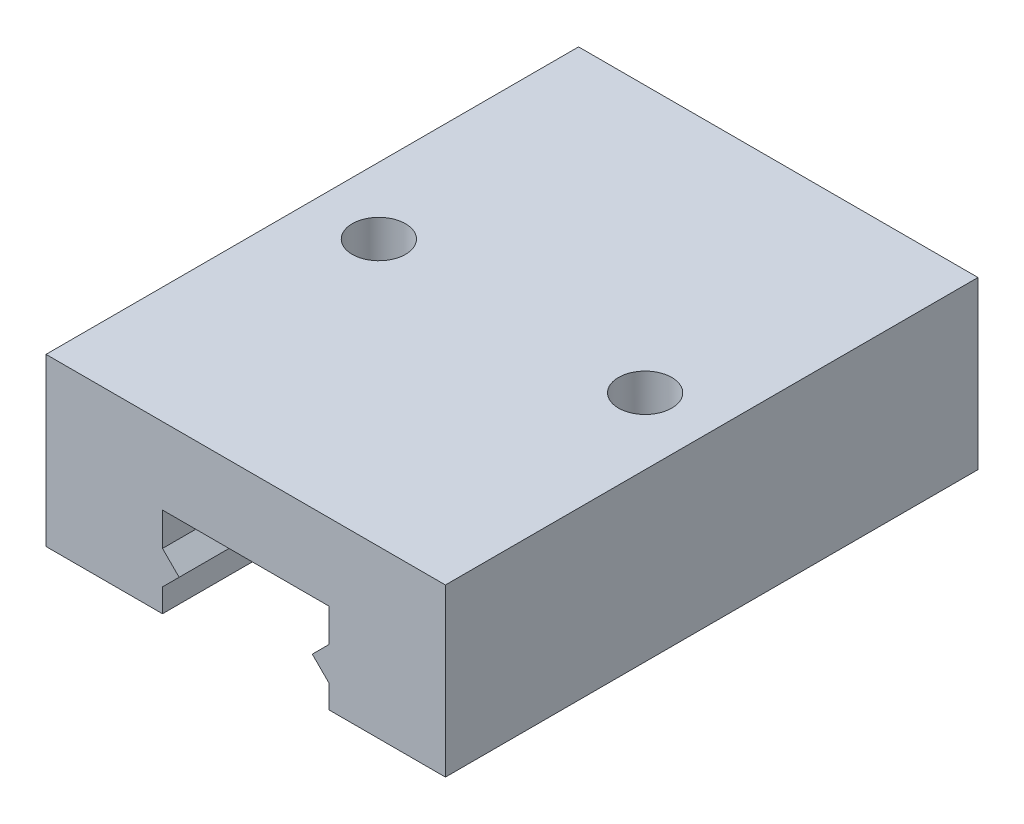
ISO-10303-21;
HEADER;
FILE_DESCRIPTION(('STEP AP214'),'2;1');
FILE_NAME('part.step','',(''),(''),'','','');
FILE_SCHEMA(('AUTOMOTIVE_DESIGN { 1 0 10303 214 1 1 1 1 }'));
ENDSEC;
DATA;
#1=APPLICATION_CONTEXT('core data for automotive mechanical design processes');
#2=APPLICATION_PROTOCOL_DEFINITION('international standard','automotive_design',2000,#1);
#3=PRODUCT_CONTEXT('',#1,'mechanical');
#4=PRODUCT('Part','Part','',(#3));
#5=PRODUCT_RELATED_PRODUCT_CATEGORY('part','',(#4));
#6=PRODUCT_DEFINITION_FORMATION('','',#4);
#7=PRODUCT_DEFINITION_CONTEXT('part definition',#1,'design');
#8=PRODUCT_DEFINITION('design','',#6,#7);
#9=PRODUCT_DEFINITION_SHAPE('','',#8);
#10=(LENGTH_UNIT() NAMED_UNIT(*) SI_UNIT(.MILLI.,.METRE.));
#11=(NAMED_UNIT(*) PLANE_ANGLE_UNIT() SI_UNIT($,.RADIAN.));
#12=(NAMED_UNIT(*) SI_UNIT($,.STERADIAN.) SOLID_ANGLE_UNIT());
#13=UNCERTAINTY_MEASURE_WITH_UNIT(LENGTH_MEASURE(1.E-05),#10,'distance_accuracy_value','');
#14=(GEOMETRIC_REPRESENTATION_CONTEXT(3) GLOBAL_UNCERTAINTY_ASSIGNED_CONTEXT((#13)) GLOBAL_UNIT_ASSIGNED_CONTEXT((#10,
#11,#12)) REPRESENTATION_CONTEXT('',''));
#15=CARTESIAN_POINT('',(0.,0.,0.));
#16=DIRECTION('',(0.,0.,1.));
#17=DIRECTION('',(1.,0.,0.));
#18=AXIS2_PLACEMENT_3D('',#15,#16,#17);
#19=CARTESIAN_POINT('',(-6.,0.,16.));
#20=DIRECTION('',(1.,0.,0.));
#21=DIRECTION('',(0.,1.,0.));
#22=AXIS2_PLACEMENT_3D('',#19,#20,#21);
#23=PLANE('',#22);
#24=DIRECTION('',(0.,-1.,0.));
#25=VECTOR('',#24,1.);
#26=CARTESIAN_POINT('',(-6.,0.,0.));
#27=LINE('',#26,#25);
#28=CARTESIAN_POINT('',(-6.,0.,0.));
#29=VERTEX_POINT('',#28);
#30=CARTESIAN_POINT('',(-6.,-5.,0.));
#31=VERTEX_POINT('',#30);
#32=EDGE_CURVE('E173',#29,#31,#27,.T.);
#33=ORIENTED_EDGE('',*,*,#32,.T.);
#34=DIRECTION('',(0.,0.,-1.));
#35=VECTOR('',#34,1.);
#36=CARTESIAN_POINT('',(-6.,-5.,16.));
#37=LINE('',#36,#35);
#38=CARTESIAN_POINT('',(-6.,-5.,16.));
#39=VERTEX_POINT('',#38);
#40=EDGE_CURVE('E11',#39,#31,#37,.T.);
#41=ORIENTED_EDGE('',*,*,#40,.F.);
#42=DIRECTION('',(0.,-1.,0.));
#43=VECTOR('',#42,1.);
#44=CARTESIAN_POINT('',(-6.,0.,16.));
#45=LINE('',#44,#43);
#46=CARTESIAN_POINT('',(-6.,0.,16.));
#47=VERTEX_POINT('',#46);
#48=EDGE_CURVE('E200',#47,#39,#45,.T.);
#49=ORIENTED_EDGE('',*,*,#48,.F.);
#50=DIRECTION('',(0.,0.,-1.));
#51=VECTOR('',#50,1.);
#52=CARTESIAN_POINT('',(-6.,0.,16.));
#53=LINE('',#52,#51);
#54=EDGE_CURVE('E169',#47,#29,#53,.T.);
#55=ORIENTED_EDGE('',*,*,#54,.T.);
#56=EDGE_LOOP('',(#33,#41,#49,#55));
#57=FACE_BOUND('',#56,.T.);
#58=ADVANCED_FACE('F41',(#57),#23,.F.);
#59=CARTESIAN_POINT('',(-6.,-5.,16.));
#60=DIRECTION('',(0.,1.,0.));
#61=DIRECTION('',(0.,0.,1.));
#62=AXIS2_PLACEMENT_3D('',#59,#60,#61);
#63=PLANE('',#62);
#64=CARTESIAN_POINT('',(-4.,-5.,8.));
#65=DIRECTION('',(0.,1.,0.));
#66=DIRECTION('',(0.,0.,1.));
#67=AXIS2_PLACEMENT_3D('',#64,#65,#66);
#68=CIRCLE('',#67,0.8);
#69=CARTESIAN_POINT('',(-4.,-5.,8.8));
#70=VERTEX_POINT('',#69);
#71=EDGE_CURVE('E177',#70,#70,#68,.T.);
#72=ORIENTED_EDGE('',*,*,#71,.T.);
#73=EDGE_LOOP('',(#72));
#74=FACE_BOUND('',#73,.T.);
#75=DIRECTION('',(1.,0.,0.));
#76=VECTOR('',#75,1.);
#77=CARTESIAN_POINT('',(-6.,-5.,0.));
#78=LINE('',#77,#76);
#79=CARTESIAN_POINT('',(-2.5,-5.,0.));
#80=VERTEX_POINT('',#79);
#81=EDGE_CURVE('E176',#31,#80,#78,.T.);
#82=ORIENTED_EDGE('',*,*,#81,.T.);
#83=DIRECTION('',(0.,0.,-1.));
#84=VECTOR('',#83,1.);
#85=CARTESIAN_POINT('',(-2.5,-5.,16.));
#86=LINE('',#85,#84);
#87=CARTESIAN_POINT('',(-2.5,-5.,16.));
#88=VERTEX_POINT('',#87);
#89=EDGE_CURVE('E49',#88,#80,#86,.T.);
#90=ORIENTED_EDGE('',*,*,#89,.F.);
#91=DIRECTION('',(1.,0.,0.));
#92=VECTOR('',#91,1.);
#93=CARTESIAN_POINT('',(-6.,-5.,16.));
#94=LINE('',#93,#92);
#95=EDGE_CURVE('E118',#39,#88,#94,.T.);
#96=ORIENTED_EDGE('',*,*,#95,.F.);
#97=ORIENTED_EDGE('',*,*,#40,.T.);
#98=EDGE_LOOP('',(#82,#90,#96,#97));
#99=FACE_BOUND('',#98,.T.);
#100=ADVANCED_FACE('F291',(#74,#99),#63,.F.);
#101=CARTESIAN_POINT('',(-2.5,-5.,16.));
#102=DIRECTION('',(-1.,0.,0.));
#103=DIRECTION('',(0.,0.,1.));
#104=AXIS2_PLACEMENT_3D('',#101,#102,#103);
#105=PLANE('',#104);
#106=DIRECTION('',(0.,1.,0.));
#107=VECTOR('',#106,1.);
#108=CARTESIAN_POINT('',(-2.5,-5.,0.));
#109=LINE('',#108,#107);
#110=CARTESIAN_POINT('',(-2.5,-4.3,0.));
#111=VERTEX_POINT('',#110);
#112=EDGE_CURVE('E179',#80,#111,#109,.T.);
#113=ORIENTED_EDGE('',*,*,#112,.T.);
#114=DIRECTION('',(0.,0.,-1.));
#115=VECTOR('',#114,1.);
#116=CARTESIAN_POINT('',(-2.5,-4.3,16.));
#117=LINE('',#116,#115);
#118=CARTESIAN_POINT('',(-2.5,-4.3,16.));
#119=VERTEX_POINT('',#118);
#120=EDGE_CURVE('E225',#119,#111,#117,.T.);
#121=ORIENTED_EDGE('',*,*,#120,.F.);
#122=DIRECTION('',(0.,1.,0.));
#123=VECTOR('',#122,1.);
#124=CARTESIAN_POINT('',(-2.5,-5.,16.));
#125=LINE('',#124,#123);
#126=EDGE_CURVE('E233',#88,#119,#125,.T.);
#127=ORIENTED_EDGE('',*,*,#126,.F.);
#128=ORIENTED_EDGE('',*,*,#89,.T.);
#129=EDGE_LOOP('',(#113,#121,#127,#128));
#130=FACE_BOUND('',#129,.T.);
#131=ADVANCED_FACE('F231',(#130),#105,.F.);
#132=CARTESIAN_POINT('',(-2.5,-4.3,16.));
#133=DIRECTION('',(-0.707106781186549,0.707106781186546,0.));
#134=DIRECTION('',(-0.707106781186546,-0.707106781186549,0.));
#135=AXIS2_PLACEMENT_3D('',#132,#133,#134);
#136=PLANE('',#135);
#137=DIRECTION('',(0.707106781186546,0.707106781186549,0.));
#138=VECTOR('',#137,1.);
#139=CARTESIAN_POINT('',(-2.5,-4.3,0.));
#140=LINE('',#139,#138);
#141=CARTESIAN_POINT('',(-2.,-3.8,0.));
#142=VERTEX_POINT('',#141);
#143=EDGE_CURVE('E181',#111,#142,#140,.T.);
#144=ORIENTED_EDGE('',*,*,#143,.T.);
#145=DIRECTION('',(0.,0.,-1.));
#146=VECTOR('',#145,1.);
#147=CARTESIAN_POINT('',(-2.,-3.8,16.));
#148=LINE('',#147,#146);
#149=CARTESIAN_POINT('',(-2.,-3.8,16.));
#150=VERTEX_POINT('',#149);
#151=EDGE_CURVE('E222',#150,#142,#148,.T.);
#152=ORIENTED_EDGE('',*,*,#151,.F.);
#153=DIRECTION('',(0.707106781186546,0.707106781186549,0.));
#154=VECTOR('',#153,1.);
#155=CARTESIAN_POINT('',(-2.5,-4.3,16.));
#156=LINE('',#155,#154);
#157=EDGE_CURVE('E251',#119,#150,#156,.T.);
#158=ORIENTED_EDGE('',*,*,#157,.F.);
#159=ORIENTED_EDGE('',*,*,#120,.T.);
#160=EDGE_LOOP('',(#144,#152,#158,#159));
#161=FACE_BOUND('',#160,.T.);
#162=ADVANCED_FACE('F242',(#161),#136,.F.);
#163=CARTESIAN_POINT('',(-2.,-3.8,16.));
#164=DIRECTION('',(-0.707106781186546,-0.707106781186549,0.));
#165=DIRECTION('',(0.707106781186549,-0.707106781186546,0.));
#166=AXIS2_PLACEMENT_3D('',#163,#164,#165);
#167=PLANE('',#166);
#168=DIRECTION('',(-0.707106781186549,0.707106781186546,0.));
#169=VECTOR('',#168,1.);
#170=CARTESIAN_POINT('',(-2.,-3.8,0.));
#171=LINE('',#170,#169);
#172=CARTESIAN_POINT('',(-2.5,-3.3,0.));
#173=VERTEX_POINT('',#172);
#174=EDGE_CURVE('E183',#142,#173,#171,.T.);
#175=ORIENTED_EDGE('',*,*,#174,.T.);
#176=DIRECTION('',(0.,0.,-1.));
#177=VECTOR('',#176,1.);
#178=CARTESIAN_POINT('',(-2.5,-3.3,16.));
#179=LINE('',#178,#177);
#180=CARTESIAN_POINT('',(-2.5,-3.3,16.));
#181=VERTEX_POINT('',#180);
#182=EDGE_CURVE('E219',#181,#173,#179,.T.);
#183=ORIENTED_EDGE('',*,*,#182,.F.);
#184=DIRECTION('',(-0.707106781186549,0.707106781186546,0.));
#185=VECTOR('',#184,1.);
#186=CARTESIAN_POINT('',(-2.,-3.8,16.));
#187=LINE('',#186,#185);
#188=EDGE_CURVE('E248',#150,#181,#187,.T.);
#189=ORIENTED_EDGE('',*,*,#188,.F.);
#190=ORIENTED_EDGE('',*,*,#151,.T.);
#191=EDGE_LOOP('',(#175,#183,#189,#190));
#192=FACE_BOUND('',#191,.T.);
#193=ADVANCED_FACE('F246',(#192),#167,.F.);
#194=CARTESIAN_POINT('',(-2.5,-3.3,16.));
#195=DIRECTION('',(-1.,0.,0.));
#196=DIRECTION('',(0.,0.,1.));
#197=AXIS2_PLACEMENT_3D('',#194,#195,#196);
#198=PLANE('',#197);
#199=DIRECTION('',(0.,1.,0.));
#200=VECTOR('',#199,1.);
#201=CARTESIAN_POINT('',(-2.5,-3.3,0.));
#202=LINE('',#201,#200);
#203=CARTESIAN_POINT('',(-2.5,-2.3,0.));
#204=VERTEX_POINT('',#203);
#205=EDGE_CURVE('E185',#173,#204,#202,.T.);
#206=ORIENTED_EDGE('',*,*,#205,.T.);
#207=DIRECTION('',(0.,0.,-1.));
#208=VECTOR('',#207,1.);
#209=CARTESIAN_POINT('',(-2.5,-2.3,16.));
#210=LINE('',#209,#208);
#211=CARTESIAN_POINT('',(-2.5,-2.3,16.));
#212=VERTEX_POINT('',#211);
#213=EDGE_CURVE('E216',#212,#204,#210,.T.);
#214=ORIENTED_EDGE('',*,*,#213,.F.);
#215=DIRECTION('',(0.,1.,0.));
#216=VECTOR('',#215,1.);
#217=CARTESIAN_POINT('',(-2.5,-3.3,16.));
#218=LINE('',#217,#216);
#219=EDGE_CURVE('E250',#181,#212,#218,.T.);
#220=ORIENTED_EDGE('',*,*,#219,.F.);
#221=ORIENTED_EDGE('',*,*,#182,.T.);
#222=EDGE_LOOP('',(#206,#214,#220,#221));
#223=FACE_BOUND('',#222,.T.);
#224=ADVANCED_FACE('F306',(#223),#198,.F.);
#225=CARTESIAN_POINT('',(-2.5,-2.3,16.));
#226=DIRECTION('',(0.,1.,0.));
#227=DIRECTION('',(0.,0.,1.));
#228=AXIS2_PLACEMENT_3D('',#225,#226,#227);
#229=PLANE('',#228);
#230=DIRECTION('',(1.,0.,0.));
#231=VECTOR('',#230,1.);
#232=CARTESIAN_POINT('',(-2.5,-2.3,0.));
#233=LINE('',#232,#231);
#234=CARTESIAN_POINT('',(2.5,-2.3,0.));
#235=VERTEX_POINT('',#234);
#236=EDGE_CURVE('E187',#204,#235,#233,.T.);
#237=ORIENTED_EDGE('',*,*,#236,.T.);
#238=DIRECTION('',(0.,0.,-1.));
#239=VECTOR('',#238,1.);
#240=CARTESIAN_POINT('',(2.5,-2.3,16.));
#241=LINE('',#240,#239);
#242=CARTESIAN_POINT('',(2.5,-2.3,16.));
#243=VERTEX_POINT('',#242);
#244=EDGE_CURVE('E213',#243,#235,#241,.T.);
#245=ORIENTED_EDGE('',*,*,#244,.F.);
#246=DIRECTION('',(1.,0.,0.));
#247=VECTOR('',#246,1.);
#248=CARTESIAN_POINT('',(-2.5,-2.3,16.));
#249=LINE('',#248,#247);
#250=EDGE_CURVE('E253',#212,#243,#249,.T.);
#251=ORIENTED_EDGE('',*,*,#250,.F.);
#252=ORIENTED_EDGE('',*,*,#213,.T.);
#253=EDGE_LOOP('',(#237,#245,#251,#252));
#254=FACE_BOUND('',#253,.T.);
#255=ADVANCED_FACE('F309',(#254),#229,.F.);
#256=CARTESIAN_POINT('',(2.5,-3.3,16.));
#257=DIRECTION('',(1.,0.,0.));
#258=DIRECTION('',(0.,0.,-1.));
#259=AXIS2_PLACEMENT_3D('',#256,#257,#258);
#260=PLANE('',#259);
#261=DIRECTION('',(0.,-1.,0.));
#262=VECTOR('',#261,1.);
#263=CARTESIAN_POINT('',(2.5,-3.3,0.));
#264=LINE('',#263,#262);
#265=CARTESIAN_POINT('',(2.5,-3.3,0.));
#266=VERTEX_POINT('',#265);
#267=EDGE_CURVE('E189',#235,#266,#264,.T.);
#268=ORIENTED_EDGE('',*,*,#267,.T.);
#269=DIRECTION('',(0.,0.,-1.));
#270=VECTOR('',#269,1.);
#271=CARTESIAN_POINT('',(2.5,-3.3,16.));
#272=LINE('',#271,#270);
#273=CARTESIAN_POINT('',(2.5,-3.3,16.));
#274=VERTEX_POINT('',#273);
#275=EDGE_CURVE('E210',#274,#266,#272,.T.);
#276=ORIENTED_EDGE('',*,*,#275,.F.);
#277=DIRECTION('',(0.,-1.,0.));
#278=VECTOR('',#277,1.);
#279=CARTESIAN_POINT('',(2.5,-3.3,16.));
#280=LINE('',#279,#278);
#281=EDGE_CURVE('E259',#243,#274,#280,.T.);
#282=ORIENTED_EDGE('',*,*,#281,.F.);
#283=ORIENTED_EDGE('',*,*,#244,.T.);
#284=EDGE_LOOP('',(#268,#276,#282,#283));
#285=FACE_BOUND('',#284,.T.);
#286=ADVANCED_FACE('F313',(#285),#260,.F.);
#287=CARTESIAN_POINT('',(2.,-3.8,16.));
#288=DIRECTION('',(0.707106781186546,-0.707106781186549,0.));
#289=DIRECTION('',(0.707106781186549,0.707106781186546,0.));
#290=AXIS2_PLACEMENT_3D('',#287,#288,#289);
#291=PLANE('',#290);
#292=DIRECTION('',(-0.707106781186549,-0.707106781186546,0.));
#293=VECTOR('',#292,1.);
#294=CARTESIAN_POINT('',(2.,-3.8,0.));
#295=LINE('',#294,#293);
#296=CARTESIAN_POINT('',(2.,-3.8,0.));
#297=VERTEX_POINT('',#296);
#298=EDGE_CURVE('E191',#266,#297,#295,.T.);
#299=ORIENTED_EDGE('',*,*,#298,.T.);
#300=DIRECTION('',(0.,0.,-1.));
#301=VECTOR('',#300,1.);
#302=CARTESIAN_POINT('',(2.,-3.8,16.));
#303=LINE('',#302,#301);
#304=CARTESIAN_POINT('',(2.,-3.8,16.));
#305=VERTEX_POINT('',#304);
#306=EDGE_CURVE('E207',#305,#297,#303,.T.);
#307=ORIENTED_EDGE('',*,*,#306,.F.);
#308=DIRECTION('',(-0.707106781186549,-0.707106781186546,0.));
#309=VECTOR('',#308,1.);
#310=CARTESIAN_POINT('',(2.,-3.8,16.));
#311=LINE('',#310,#309);
#312=EDGE_CURVE('E261',#274,#305,#311,.T.);
#313=ORIENTED_EDGE('',*,*,#312,.F.);
#314=ORIENTED_EDGE('',*,*,#275,.T.);
#315=EDGE_LOOP('',(#299,#307,#313,#314));
#316=FACE_BOUND('',#315,.T.);
#317=ADVANCED_FACE('F317',(#316),#291,.F.);
#318=CARTESIAN_POINT('',(2.5,-4.3,16.));
#319=DIRECTION('',(0.707106781186549,0.707106781186546,0.));
#320=DIRECTION('',(-0.707106781186546,0.707106781186549,0.));
#321=AXIS2_PLACEMENT_3D('',#318,#319,#320);
#322=PLANE('',#321);
#323=DIRECTION('',(0.707106781186546,-0.707106781186549,0.));
#324=VECTOR('',#323,1.);
#325=CARTESIAN_POINT('',(2.5,-4.3,0.));
#326=LINE('',#325,#324);
#327=CARTESIAN_POINT('',(2.5,-4.3,0.));
#328=VERTEX_POINT('',#327);
#329=EDGE_CURVE('E193',#297,#328,#326,.T.);
#330=ORIENTED_EDGE('',*,*,#329,.T.);
#331=DIRECTION('',(0.,0.,-1.));
#332=VECTOR('',#331,1.);
#333=CARTESIAN_POINT('',(2.5,-4.3,16.));
#334=LINE('',#333,#332);
#335=CARTESIAN_POINT('',(2.5,-4.3,16.));
#336=VERTEX_POINT('',#335);
#337=EDGE_CURVE('E204',#336,#328,#334,.T.);
#338=ORIENTED_EDGE('',*,*,#337,.F.);
#339=DIRECTION('',(0.707106781186546,-0.707106781186549,0.));
#340=VECTOR('',#339,1.);
#341=CARTESIAN_POINT('',(2.5,-4.3,16.));
#342=LINE('',#341,#340);
#343=EDGE_CURVE('E263',#305,#336,#342,.T.);
#344=ORIENTED_EDGE('',*,*,#343,.F.);
#345=ORIENTED_EDGE('',*,*,#306,.T.);
#346=EDGE_LOOP('',(#330,#338,#344,#345));
#347=FACE_BOUND('',#346,.T.);
#348=ADVANCED_FACE('F269',(#347),#322,.F.);
#349=CARTESIAN_POINT('',(2.5,-5.,16.));
#350=DIRECTION('',(1.,0.,0.));
#351=DIRECTION('',(0.,0.,-1.));
#352=AXIS2_PLACEMENT_3D('',#349,#350,#351);
#353=PLANE('',#352);
#354=DIRECTION('',(0.,-1.,0.));
#355=VECTOR('',#354,1.);
#356=CARTESIAN_POINT('',(2.5,-5.,0.));
#357=LINE('',#356,#355);
#358=CARTESIAN_POINT('',(2.5,-5.,0.));
#359=VERTEX_POINT('',#358);
#360=EDGE_CURVE('E195',#328,#359,#357,.T.);
#361=ORIENTED_EDGE('',*,*,#360,.T.);
#362=DIRECTION('',(0.,0.,-1.));
#363=VECTOR('',#362,1.);
#364=CARTESIAN_POINT('',(2.5,-5.,16.));
#365=LINE('',#364,#363);
#366=CARTESIAN_POINT('',(2.5,-5.,16.));
#367=VERTEX_POINT('',#366);
#368=EDGE_CURVE('E164',#367,#359,#365,.T.);
#369=ORIENTED_EDGE('',*,*,#368,.F.);
#370=DIRECTION('',(0.,-1.,0.));
#371=VECTOR('',#370,1.);
#372=CARTESIAN_POINT('',(2.5,-5.,16.));
#373=LINE('',#372,#371);
#374=EDGE_CURVE('E155',#336,#367,#373,.T.);
#375=ORIENTED_EDGE('',*,*,#374,.F.);
#376=ORIENTED_EDGE('',*,*,#337,.T.);
#377=EDGE_LOOP('',(#361,#369,#375,#376));
#378=FACE_BOUND('',#377,.T.);
#379=ADVANCED_FACE('F273',(#378),#353,.F.);
#380=CARTESIAN_POINT('',(6.,-5.,16.));
#381=DIRECTION('',(0.,1.,0.));
#382=DIRECTION('',(0.,0.,1.));
#383=AXIS2_PLACEMENT_3D('',#380,#381,#382);
#384=PLANE('',#383);
#385=CARTESIAN_POINT('',(4.,-5.,8.));
#386=DIRECTION('',(0.,1.,0.));
#387=DIRECTION('',(0.,0.,1.));
#388=AXIS2_PLACEMENT_3D('',#385,#386,#387);
#389=CIRCLE('',#388,0.8);
#390=CARTESIAN_POINT('',(4.,-5.,8.8));
#391=VERTEX_POINT('',#390);
#392=EDGE_CURVE('E332',#391,#391,#389,.T.);
#393=ORIENTED_EDGE('',*,*,#392,.T.);
#394=EDGE_LOOP('',(#393));
#395=FACE_BOUND('',#394,.T.);
#396=DIRECTION('',(1.,0.,0.));
#397=VECTOR('',#396,1.);
#398=CARTESIAN_POINT('',(6.,-5.,0.));
#399=LINE('',#398,#397);
#400=CARTESIAN_POINT('',(6.,-5.,0.));
#401=VERTEX_POINT('',#400);
#402=EDGE_CURVE('E163',#359,#401,#399,.T.);
#403=ORIENTED_EDGE('',*,*,#402,.T.);
#404=DIRECTION('',(0.,0.,-1.));
#405=VECTOR('',#404,1.);
#406=CARTESIAN_POINT('',(6.,-5.,16.));
#407=LINE('',#406,#405);
#408=CARTESIAN_POINT('',(6.,-5.,16.));
#409=VERTEX_POINT('',#408);
#410=EDGE_CURVE('E160',#409,#401,#407,.T.);
#411=ORIENTED_EDGE('',*,*,#410,.F.);
#412=DIRECTION('',(1.,0.,0.));
#413=VECTOR('',#412,1.);
#414=CARTESIAN_POINT('',(6.,-5.,16.));
#415=LINE('',#414,#413);
#416=EDGE_CURVE('E149',#367,#409,#415,.T.);
#417=ORIENTED_EDGE('',*,*,#416,.F.);
#418=ORIENTED_EDGE('',*,*,#368,.T.);
#419=EDGE_LOOP('',(#403,#411,#417,#418));
#420=FACE_BOUND('',#419,.T.);
#421=ADVANCED_FACE('F161',(#395,#420),#384,.F.);
#422=CARTESIAN_POINT('',(6.,0.,16.));
#423=DIRECTION('',(-1.,0.,0.));
#424=DIRECTION('',(0.,-1.,0.));
#425=AXIS2_PLACEMENT_3D('',#422,#423,#424);
#426=PLANE('',#425);
#427=DIRECTION('',(0.,1.,0.));
#428=VECTOR('',#427,1.);
#429=CARTESIAN_POINT('',(6.,0.,0.));
#430=LINE('',#429,#428);
#431=CARTESIAN_POINT('',(6.,0.,0.));
#432=VERTEX_POINT('',#431);
#433=EDGE_CURVE('E104',#401,#432,#430,.T.);
#434=ORIENTED_EDGE('',*,*,#433,.T.);
#435=DIRECTION('',(0.,0.,-1.));
#436=VECTOR('',#435,1.);
#437=CARTESIAN_POINT('',(6.,0.,16.));
#438=LINE('',#437,#436);
#439=CARTESIAN_POINT('',(6.,0.,16.));
#440=VERTEX_POINT('',#439);
#441=EDGE_CURVE('E165',#440,#432,#438,.T.);
#442=ORIENTED_EDGE('',*,*,#441,.F.);
#443=DIRECTION('',(0.,1.,0.));
#444=VECTOR('',#443,1.);
#445=CARTESIAN_POINT('',(6.,0.,16.));
#446=LINE('',#445,#444);
#447=EDGE_CURVE('E153',#409,#440,#446,.T.);
#448=ORIENTED_EDGE('',*,*,#447,.F.);
#449=ORIENTED_EDGE('',*,*,#410,.T.);
#450=EDGE_LOOP('',(#434,#442,#448,#449));
#451=FACE_BOUND('',#450,.T.);
#452=ADVANCED_FACE('F167',(#451),#426,.F.);
#453=CARTESIAN_POINT('',(6.,0.,16.));
#454=DIRECTION('',(0.,-1.,0.));
#455=DIRECTION('',(0.,0.,-1.));
#456=AXIS2_PLACEMENT_3D('',#453,#454,#455);
#457=PLANE('',#456);
#458=CARTESIAN_POINT('',(-4.,0.,8.));
#459=DIRECTION('',(0.,1.,0.));
#460=DIRECTION('',(0.,0.,1.));
#461=AXIS2_PLACEMENT_3D('',#458,#459,#460);
#462=CIRCLE('',#461,0.8);
#463=CARTESIAN_POINT('',(-4.,0.,8.8));
#464=VERTEX_POINT('',#463);
#465=EDGE_CURVE('E334',#464,#464,#462,.T.);
#466=ORIENTED_EDGE('',*,*,#465,.F.);
#467=EDGE_LOOP('',(#466));
#468=FACE_BOUND('',#467,.T.);
#469=CARTESIAN_POINT('',(4.,0.,8.));
#470=DIRECTION('',(0.,1.,0.));
#471=DIRECTION('',(0.,0.,-1.));
#472=AXIS2_PLACEMENT_3D('',#469,#470,#471);
#473=CIRCLE('',#472,0.8);
#474=CARTESIAN_POINT('',(4.,0.,7.2));
#475=VERTEX_POINT('',#474);
#476=EDGE_CURVE('E338',#475,#475,#473,.T.);
#477=ORIENTED_EDGE('',*,*,#476,.F.);
#478=EDGE_LOOP('',(#477));
#479=FACE_BOUND('',#478,.T.);
#480=DIRECTION('',(-1.,0.,0.));
#481=VECTOR('',#480,1.);
#482=CARTESIAN_POINT('',(6.,0.,0.));
#483=LINE('',#482,#481);
#484=EDGE_CURVE('E110',#432,#29,#483,.T.);
#485=ORIENTED_EDGE('',*,*,#484,.T.);
#486=ORIENTED_EDGE('',*,*,#54,.F.);
#487=DIRECTION('',(-1.,0.,0.));
#488=VECTOR('',#487,1.);
#489=CARTESIAN_POINT('',(6.,0.,16.));
#490=LINE('',#489,#488);
#491=EDGE_CURVE('E57',#440,#47,#490,.T.);
#492=ORIENTED_EDGE('',*,*,#491,.F.);
#493=ORIENTED_EDGE('',*,*,#441,.T.);
#494=EDGE_LOOP('',(#485,#486,#492,#493));
#495=FACE_BOUND('',#494,.T.);
#496=ADVANCED_FACE('F277',(#468,#479,#495),#457,.F.);
#497=CARTESIAN_POINT('',(0.,0.,16.));
#498=DIRECTION('',(0.,0.,1.));
#499=DIRECTION('',(1.,0.,0.));
#500=AXIS2_PLACEMENT_3D('',#497,#498,#499);
#501=PLANE('',#500);
#502=ORIENTED_EDGE('',*,*,#48,.T.);
#503=ORIENTED_EDGE('',*,*,#95,.T.);
#504=ORIENTED_EDGE('',*,*,#126,.T.);
#505=ORIENTED_EDGE('',*,*,#157,.T.);
#506=ORIENTED_EDGE('',*,*,#188,.T.);
#507=ORIENTED_EDGE('',*,*,#219,.T.);
#508=ORIENTED_EDGE('',*,*,#250,.T.);
#509=ORIENTED_EDGE('',*,*,#281,.T.);
#510=ORIENTED_EDGE('',*,*,#312,.T.);
#511=ORIENTED_EDGE('',*,*,#343,.T.);
#512=ORIENTED_EDGE('',*,*,#374,.T.);
#513=ORIENTED_EDGE('',*,*,#416,.T.);
#514=ORIENTED_EDGE('',*,*,#447,.T.);
#515=ORIENTED_EDGE('',*,*,#491,.T.);
#516=EDGE_LOOP('',(#502,#503,#504,#505,#506,#507,#508,#509,#510,#511,#512,#513,#514,#515));
#517=FACE_BOUND('',#516,.T.);
#518=ADVANCED_FACE('F151',(#517),#501,.T.);
#519=CARTESIAN_POINT('',(0.,0.,0.));
#520=DIRECTION('',(0.,0.,1.));
#521=DIRECTION('',(1.,0.,0.));
#522=AXIS2_PLACEMENT_3D('',#519,#520,#521);
#523=PLANE('',#522);
#524=ORIENTED_EDGE('',*,*,#32,.F.);
#525=ORIENTED_EDGE('',*,*,#484,.F.);
#526=ORIENTED_EDGE('',*,*,#433,.F.);
#527=ORIENTED_EDGE('',*,*,#402,.F.);
#528=ORIENTED_EDGE('',*,*,#360,.F.);
#529=ORIENTED_EDGE('',*,*,#329,.F.);
#530=ORIENTED_EDGE('',*,*,#298,.F.);
#531=ORIENTED_EDGE('',*,*,#267,.F.);
#532=ORIENTED_EDGE('',*,*,#236,.F.);
#533=ORIENTED_EDGE('',*,*,#205,.F.);
#534=ORIENTED_EDGE('',*,*,#174,.F.);
#535=ORIENTED_EDGE('',*,*,#143,.F.);
#536=ORIENTED_EDGE('',*,*,#112,.F.);
#537=ORIENTED_EDGE('',*,*,#81,.F.);
#538=EDGE_LOOP('',(#524,#525,#526,#527,#528,#529,#530,#531,#532,#533,#534,#535,#536,#537));
#539=FACE_BOUND('',#538,.T.);
#540=ADVANCED_FACE('F237',(#539),#523,.F.);
#541=CARTESIAN_POINT('',(4.,-16.,8.));
#542=DIRECTION('',(0.,1.,0.));
#543=DIRECTION('',(0.,0.,1.));
#544=AXIS2_PLACEMENT_3D('',#541,#542,#543);
#545=CYLINDRICAL_SURFACE('',#544,0.8);
#546=ORIENTED_EDGE('',*,*,#476,.T.);
#547=EDGE_LOOP('',(#546));
#548=FACE_BOUND('',#547,.T.);
#549=ORIENTED_EDGE('',*,*,#392,.F.);
#550=EDGE_LOOP('',(#549));
#551=FACE_BOUND('',#550,.T.);
#552=ADVANCED_FACE('F346',(#548,#551),#545,.F.);
#553=CARTESIAN_POINT('',(-4.,-16.,8.));
#554=DIRECTION('',(0.,1.,0.));
#555=DIRECTION('',(0.,0.,1.));
#556=AXIS2_PLACEMENT_3D('',#553,#554,#555);
#557=CYLINDRICAL_SURFACE('',#556,0.8);
#558=ORIENTED_EDGE('',*,*,#465,.T.);
#559=EDGE_LOOP('',(#558));
#560=FACE_BOUND('',#559,.T.);
#561=ORIENTED_EDGE('',*,*,#71,.F.);
#562=EDGE_LOOP('',(#561));
#563=FACE_BOUND('',#562,.T.);
#564=ADVANCED_FACE('F348',(#560,#563),#557,.F.);
#565=CLOSED_SHELL('',(#58,#100,#131,#162,#193,#224,#255,#286,#317,#348,#379,#421,#452,#496,#518,
#540,#552,#564));
#566=MANIFOLD_SOLID_BREP('B2',#565);
#567=ADVANCED_BREP_SHAPE_REPRESENTATION('',(#18,#566),#14);
#568=SHAPE_DEFINITION_REPRESENTATION(#9,#567);
ENDSEC;
END-ISO-10303-21;
